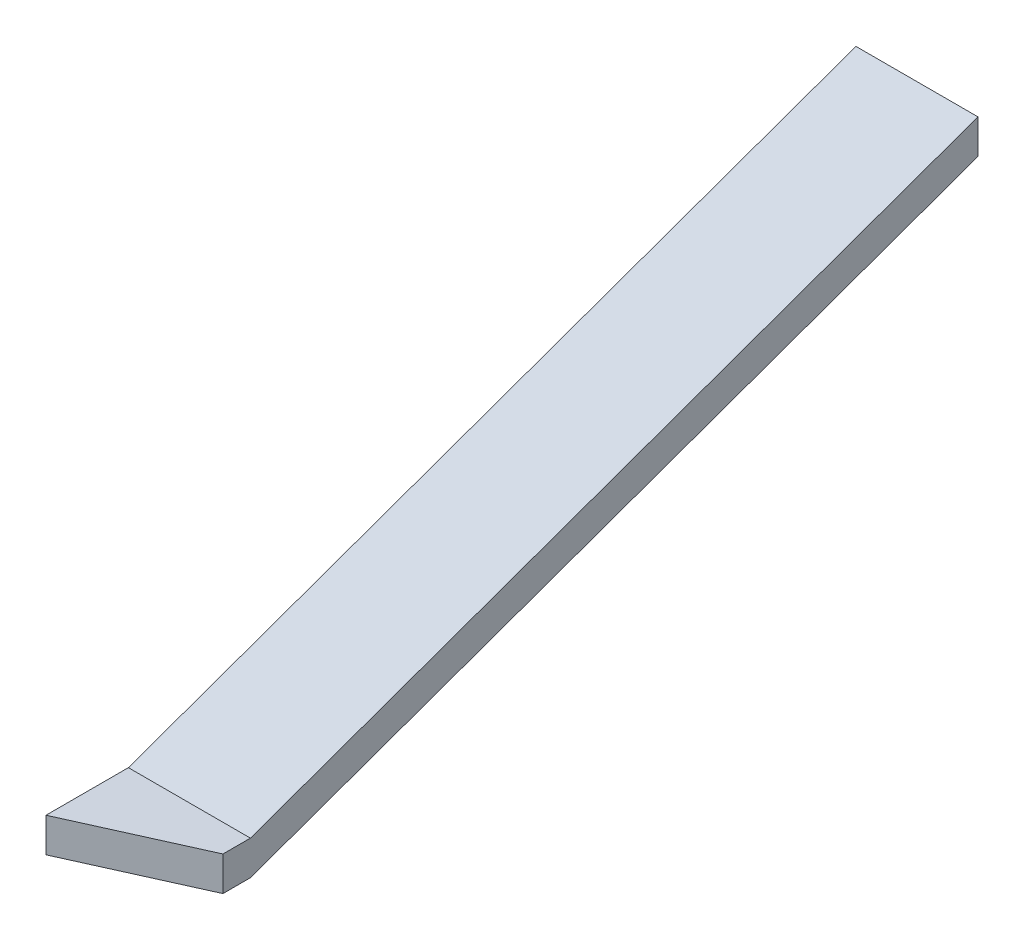
ISO-10303-21;
HEADER;
FILE_DESCRIPTION(('STEP AP214'),'2;1');
FILE_NAME('part.step','',(''),(''),'','','');
FILE_SCHEMA(('AUTOMOTIVE_DESIGN { 1 0 10303 214 1 1 1 1 }'));
ENDSEC;
DATA;
#1=APPLICATION_CONTEXT('core data for automotive mechanical design processes');
#2=APPLICATION_PROTOCOL_DEFINITION('international standard','automotive_design',2000,#1);
#3=PRODUCT_CONTEXT('',#1,'mechanical');
#4=PRODUCT('Part','Part','',(#3));
#5=PRODUCT_RELATED_PRODUCT_CATEGORY('part','',(#4));
#6=PRODUCT_DEFINITION_FORMATION('','',#4);
#7=PRODUCT_DEFINITION_CONTEXT('part definition',#1,'design');
#8=PRODUCT_DEFINITION('design','',#6,#7);
#9=PRODUCT_DEFINITION_SHAPE('','',#8);
#10=(LENGTH_UNIT() NAMED_UNIT(*) SI_UNIT(.MILLI.,.METRE.));
#11=(NAMED_UNIT(*) PLANE_ANGLE_UNIT() SI_UNIT($,.RADIAN.));
#12=(NAMED_UNIT(*) SI_UNIT($,.STERADIAN.) SOLID_ANGLE_UNIT());
#13=UNCERTAINTY_MEASURE_WITH_UNIT(LENGTH_MEASURE(1.E-05),#10,'distance_accuracy_value','');
#14=(GEOMETRIC_REPRESENTATION_CONTEXT(3) GLOBAL_UNCERTAINTY_ASSIGNED_CONTEXT((#13)) GLOBAL_UNIT_ASSIGNED_CONTEXT((#10,
#11,#12)) REPRESENTATION_CONTEXT('',''));
#15=CARTESIAN_POINT('',(0.,0.,0.));
#16=DIRECTION('',(0.,0.,1.));
#17=DIRECTION('',(1.,0.,0.));
#18=AXIS2_PLACEMENT_3D('',#15,#16,#17);
#19=CARTESIAN_POINT('',(0.,0.,-60.));
#20=DIRECTION('',(-1.,0.,0.));
#21=DIRECTION('',(0.,0.,1.));
#22=AXIS2_PLACEMENT_3D('',#19,#20,#21);
#23=PLANE('',#22);
#24=DIRECTION('',(0.,-1.,0.));
#25=VECTOR('',#24,1.);
#26=CARTESIAN_POINT('',(0.,0.,0.));
#27=LINE('',#26,#25);
#28=CARTESIAN_POINT('',(0.,25.,0.));
#29=VERTEX_POINT('',#28);
#30=CARTESIAN_POINT('',(0.,0.,0.));
#31=VERTEX_POINT('',#30);
#32=EDGE_CURVE('E108',#29,#31,#27,.T.);
#33=ORIENTED_EDGE('',*,*,#32,.F.);
#34=DIRECTION('',(0.,0.,1.));
#35=VECTOR('',#34,1.);
#36=CARTESIAN_POINT('',(0.,25.,-60.));
#37=LINE('',#36,#35);
#38=CARTESIAN_POINT('',(0.,25.,-60.));
#39=VERTEX_POINT('',#38);
#40=EDGE_CURVE('E11',#39,#29,#37,.T.);
#41=ORIENTED_EDGE('',*,*,#40,.F.);
#42=DIRECTION('',(0.,-0.337461295829559,0.941339404156139));
#43=VECTOR('',#42,1.);
#44=CARTESIAN_POINT('',(0.,215.,-590.));
#45=LINE('',#44,#43);
#46=CARTESIAN_POINT('',(0.,215.,-590.));
#47=VERTEX_POINT('',#46);
#48=EDGE_CURVE('E111',#47,#39,#45,.T.);
#49=ORIENTED_EDGE('',*,*,#48,.F.);
#50=DIRECTION('',(0.,1.,0.));
#51=VECTOR('',#50,1.);
#52=CARTESIAN_POINT('',(0.,215.,-590.));
#53=LINE('',#52,#51);
#54=CARTESIAN_POINT('',(0.,190.,-590.));
#55=VERTEX_POINT('',#54);
#56=EDGE_CURVE('E119',#55,#47,#53,.T.);
#57=ORIENTED_EDGE('',*,*,#56,.F.);
#58=DIRECTION('',(0.,-0.337461295829559,0.941339404156139));
#59=VECTOR('',#58,1.);
#60=CARTESIAN_POINT('',(0.,190.,-590.));
#61=LINE('',#60,#59);
#62=CARTESIAN_POINT('',(0.,0.,-60.));
#63=VERTEX_POINT('',#62);
#64=EDGE_CURVE('E121',#55,#63,#61,.T.);
#65=ORIENTED_EDGE('',*,*,#64,.T.);
#66=DIRECTION('',(0.,0.,1.));
#67=VECTOR('',#66,1.);
#68=CARTESIAN_POINT('',(0.,0.,-60.));
#69=LINE('',#68,#67);
#70=EDGE_CURVE('E38',#63,#31,#69,.T.);
#71=ORIENTED_EDGE('',*,*,#70,.T.);
#72=EDGE_LOOP('',(#33,#41,#49,#57,#65,#71));
#73=FACE_BOUND('',#72,.T.);
#74=ADVANCED_FACE('F35',(#73),#23,.T.);
#75=CARTESIAN_POINT('',(0.,25.,-60.));
#76=DIRECTION('',(0.,1.,0.));
#77=DIRECTION('',(0.,0.,1.));
#78=AXIS2_PLACEMENT_3D('',#75,#76,#77);
#79=PLANE('',#78);
#80=DIRECTION('',(-0.911940698035273,0.,0.41032202386289));
#81=VECTOR('',#80,1.);
#82=CARTESIAN_POINT('',(0.,25.,0.));
#83=LINE('',#82,#81);
#84=CARTESIAN_POINT('',(88.9,25.,-40.));
#85=VERTEX_POINT('',#84);
#86=EDGE_CURVE('E87',#85,#29,#83,.T.);
#87=ORIENTED_EDGE('',*,*,#86,.F.);
#88=DIRECTION('',(0.,0.,1.));
#89=VECTOR('',#88,1.);
#90=CARTESIAN_POINT('',(88.9,25.,-60.));
#91=LINE('',#90,#89);
#92=CARTESIAN_POINT('',(88.9,25.,-60.));
#93=VERTEX_POINT('',#92);
#94=EDGE_CURVE('E44',#93,#85,#91,.T.);
#95=ORIENTED_EDGE('',*,*,#94,.F.);
#96=DIRECTION('',(-1.,0.,0.));
#97=VECTOR('',#96,1.);
#98=CARTESIAN_POINT('',(0.,25.,-60.));
#99=LINE('',#98,#97);
#100=EDGE_CURVE('E112',#93,#39,#99,.T.);
#101=ORIENTED_EDGE('',*,*,#100,.T.);
#102=ORIENTED_EDGE('',*,*,#40,.T.);
#103=EDGE_LOOP('',(#87,#95,#101,#102));
#104=FACE_BOUND('',#103,.T.);
#105=ADVANCED_FACE('F96',(#104),#79,.T.);
#106=CARTESIAN_POINT('',(88.9,0.,-60.));
#107=DIRECTION('',(1.,0.,0.));
#108=DIRECTION('',(0.,0.,-1.));
#109=AXIS2_PLACEMENT_3D('',#106,#107,#108);
#110=PLANE('',#109);
#111=DIRECTION('',(0.,1.,0.));
#112=VECTOR('',#111,1.);
#113=CARTESIAN_POINT('',(88.9,-75.,-40.));
#114=LINE('',#113,#112);
#115=CARTESIAN_POINT('',(88.9,0.,-40.));
#116=VERTEX_POINT('',#115);
#117=EDGE_CURVE('E84',#116,#85,#114,.T.);
#118=ORIENTED_EDGE('',*,*,#117,.F.);
#119=DIRECTION('',(0.,0.,1.));
#120=VECTOR('',#119,1.);
#121=CARTESIAN_POINT('',(88.9,0.,-60.));
#122=LINE('',#121,#120);
#123=CARTESIAN_POINT('',(88.9,0.,-60.));
#124=VERTEX_POINT('',#123);
#125=EDGE_CURVE('E105',#124,#116,#122,.T.);
#126=ORIENTED_EDGE('',*,*,#125,.F.);
#127=DIRECTION('',(0.,-0.337461295829559,0.941339404156139));
#128=VECTOR('',#127,1.);
#129=CARTESIAN_POINT('',(88.9,190.,-590.));
#130=LINE('',#129,#128);
#131=CARTESIAN_POINT('',(88.9,190.,-590.));
#132=VERTEX_POINT('',#131);
#133=EDGE_CURVE('E51',#132,#124,#130,.T.);
#134=ORIENTED_EDGE('',*,*,#133,.F.);
#135=DIRECTION('',(0.,-1.,0.));
#136=VECTOR('',#135,1.);
#137=CARTESIAN_POINT('',(88.9,215.,-590.));
#138=LINE('',#137,#136);
#139=CARTESIAN_POINT('',(88.9,215.,-590.));
#140=VERTEX_POINT('',#139);
#141=EDGE_CURVE('E129',#140,#132,#138,.T.);
#142=ORIENTED_EDGE('',*,*,#141,.F.);
#143=DIRECTION('',(0.,-0.337461295829559,0.941339404156139));
#144=VECTOR('',#143,1.);
#145=CARTESIAN_POINT('',(88.9,215.,-590.));
#146=LINE('',#145,#144);
#147=EDGE_CURVE('E104',#140,#93,#146,.T.);
#148=ORIENTED_EDGE('',*,*,#147,.T.);
#149=ORIENTED_EDGE('',*,*,#94,.T.);
#150=EDGE_LOOP('',(#118,#126,#134,#142,#148,#149));
#151=FACE_BOUND('',#150,.T.);
#152=ADVANCED_FACE('F102',(#151),#110,.T.);
#153=CARTESIAN_POINT('',(0.,0.,-60.));
#154=DIRECTION('',(0.,-1.,0.));
#155=DIRECTION('',(0.,0.,-1.));
#156=AXIS2_PLACEMENT_3D('',#153,#154,#155);
#157=PLANE('',#156);
#158=DIRECTION('',(0.911940698035273,0.,-0.41032202386289));
#159=VECTOR('',#158,1.);
#160=CARTESIAN_POINT('',(22.4513611716462,0.,-10.1018497960163));
#161=LINE('',#160,#159);
#162=EDGE_CURVE('E89',#31,#116,#161,.T.);
#163=ORIENTED_EDGE('',*,*,#162,.F.);
#164=ORIENTED_EDGE('',*,*,#70,.F.);
#165=DIRECTION('',(1.,0.,0.));
#166=VECTOR('',#165,1.);
#167=CARTESIAN_POINT('',(0.,0.,-60.));
#168=LINE('',#167,#166);
#169=EDGE_CURVE('E110',#63,#124,#168,.T.);
#170=ORIENTED_EDGE('',*,*,#169,.T.);
#171=ORIENTED_EDGE('',*,*,#125,.T.);
#172=EDGE_LOOP('',(#163,#164,#170,#171));
#173=FACE_BOUND('',#172,.T.);
#174=ADVANCED_FACE('F139',(#173),#157,.T.);
#175=CARTESIAN_POINT('',(0.,190.,-590.));
#176=DIRECTION('',(0.,0.,-1.));
#177=DIRECTION('',(-1.,0.,0.));
#178=AXIS2_PLACEMENT_3D('',#175,#176,#177);
#179=PLANE('',#178);
#180=ORIENTED_EDGE('',*,*,#141,.T.);
#181=DIRECTION('',(-1.,0.,0.));
#182=VECTOR('',#181,1.);
#183=CARTESIAN_POINT('',(88.9,190.,-590.));
#184=LINE('',#183,#182);
#185=EDGE_CURVE('E124',#132,#55,#184,.T.);
#186=ORIENTED_EDGE('',*,*,#185,.T.);
#187=ORIENTED_EDGE('',*,*,#56,.T.);
#188=DIRECTION('',(1.,0.,0.));
#189=VECTOR('',#188,1.);
#190=CARTESIAN_POINT('',(88.9,215.,-590.));
#191=LINE('',#190,#189);
#192=EDGE_CURVE('E116',#47,#140,#191,.T.);
#193=ORIENTED_EDGE('',*,*,#192,.T.);
#194=EDGE_LOOP('',(#180,#186,#187,#193));
#195=FACE_BOUND('',#194,.T.);
#196=ADVANCED_FACE('F135',(#195),#179,.T.);
#197=CARTESIAN_POINT('',(88.9,190.,-590.));
#198=DIRECTION('',(0.,0.941339404156139,0.337461295829559));
#199=DIRECTION('',(0.,-0.337461295829559,0.941339404156139));
#200=AXIS2_PLACEMENT_3D('',#197,#198,#199);
#201=PLANE('',#200);
#202=ORIENTED_EDGE('',*,*,#64,.F.);
#203=ORIENTED_EDGE('',*,*,#185,.F.);
#204=ORIENTED_EDGE('',*,*,#133,.T.);
#205=ORIENTED_EDGE('',*,*,#169,.F.);
#206=EDGE_LOOP('',(#202,#203,#204,#205));
#207=FACE_BOUND('',#206,.T.);
#208=ADVANCED_FACE('F141',(#207),#201,.F.);
#209=CARTESIAN_POINT('',(88.9,215.,-590.));
#210=DIRECTION('',(0.,-0.941339404156139,-0.337461295829559));
#211=DIRECTION('',(0.,0.337461295829559,-0.941339404156139));
#212=AXIS2_PLACEMENT_3D('',#209,#210,#211);
#213=PLANE('',#212);
#214=ORIENTED_EDGE('',*,*,#100,.F.);
#215=ORIENTED_EDGE('',*,*,#147,.F.);
#216=ORIENTED_EDGE('',*,*,#192,.F.);
#217=ORIENTED_EDGE('',*,*,#48,.T.);
#218=EDGE_LOOP('',(#214,#215,#216,#217));
#219=FACE_BOUND('',#218,.T.);
#220=ADVANCED_FACE('F145',(#219),#213,.F.);
#221=CARTESIAN_POINT('',(0.,-75.,0.));
#222=DIRECTION('',(-0.41032202386289,0.,-0.911940698035273));
#223=DIRECTION('',(-0.911940698035273,0.,0.41032202386289));
#224=AXIS2_PLACEMENT_3D('',#221,#222,#223);
#225=PLANE('',#224);
#226=ORIENTED_EDGE('',*,*,#162,.T.);
#227=ORIENTED_EDGE('',*,*,#117,.T.);
#228=ORIENTED_EDGE('',*,*,#86,.T.);
#229=ORIENTED_EDGE('',*,*,#32,.T.);
#230=EDGE_LOOP('',(#226,#227,#228,#229));
#231=FACE_BOUND('',#230,.T.);
#232=ADVANCED_FACE('F86',(#231),#225,.F.);
#233=CLOSED_SHELL('',(#74,#105,#152,#174,#196,#208,#220,#232));
#234=MANIFOLD_SOLID_BREP('B2',#233);
#235=ADVANCED_BREP_SHAPE_REPRESENTATION('',(#18,#234),#14);
#236=SHAPE_DEFINITION_REPRESENTATION(#9,#235);
ENDSEC;
END-ISO-10303-21;
